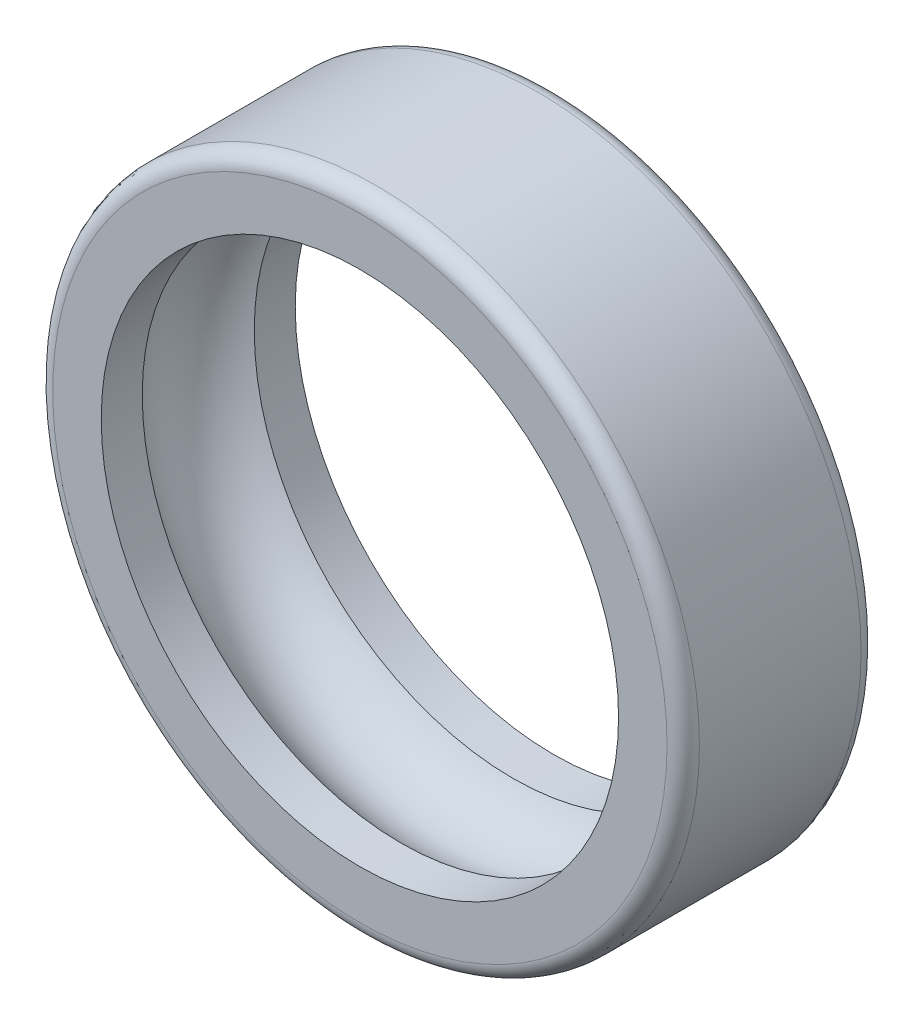
ISO-10303-21;
HEADER;
FILE_DESCRIPTION(('STEP AP214'),'2;1');
FILE_NAME('part.step','',(''),(''),'','','');
FILE_SCHEMA(('AUTOMOTIVE_DESIGN { 1 0 10303 214 1 1 1 1 }'));
ENDSEC;
DATA;
#1=APPLICATION_CONTEXT('core data for automotive mechanical design processes');
#2=APPLICATION_PROTOCOL_DEFINITION('international standard','automotive_design',2000,#1);
#3=PRODUCT_CONTEXT('',#1,'mechanical');
#4=PRODUCT('Part','Part','',(#3));
#5=PRODUCT_RELATED_PRODUCT_CATEGORY('part','',(#4));
#6=PRODUCT_DEFINITION_FORMATION('','',#4);
#7=PRODUCT_DEFINITION_CONTEXT('part definition',#1,'design');
#8=PRODUCT_DEFINITION('design','',#6,#7);
#9=PRODUCT_DEFINITION_SHAPE('','',#8);
#10=(LENGTH_UNIT() NAMED_UNIT(*) SI_UNIT(.MILLI.,.METRE.));
#11=(NAMED_UNIT(*) PLANE_ANGLE_UNIT() SI_UNIT($,.RADIAN.));
#12=(NAMED_UNIT(*) SI_UNIT($,.STERADIAN.) SOLID_ANGLE_UNIT());
#13=UNCERTAINTY_MEASURE_WITH_UNIT(LENGTH_MEASURE(1.E-05),#10,'distance_accuracy_value','');
#14=(GEOMETRIC_REPRESENTATION_CONTEXT(3) GLOBAL_UNCERTAINTY_ASSIGNED_CONTEXT((#13)) GLOBAL_UNIT_ASSIGNED_CONTEXT((#10,
#11,#12)) REPRESENTATION_CONTEXT('',''));
#15=CARTESIAN_POINT('',(0.,0.,0.));
#16=DIRECTION('',(0.,0.,1.));
#17=DIRECTION('',(1.,0.,0.));
#18=AXIS2_PLACEMENT_3D('',#15,#16,#17);
#19=CARTESIAN_POINT('',(0.,0.,3.));
#20=DIRECTION('',(0.,0.,-1.));
#21=DIRECTION('',(-1.,0.,0.));
#22=AXIS2_PLACEMENT_3D('',#19,#20,#21);
#23=CYLINDRICAL_SURFACE('',#22,8.);
#24=CARTESIAN_POINT('',(0.,0.,-1.73205080756888));
#25=DIRECTION('',(0.,0.,1.));
#26=DIRECTION('',(1.,0.,0.));
#27=AXIS2_PLACEMENT_3D('',#24,#25,#26);
#28=CIRCLE('',#27,8.);
#29=CARTESIAN_POINT('',(8.,0.,-1.73205080756888));
#30=VERTEX_POINT('',#29);
#31=EDGE_CURVE('E53',#30,#30,#28,.F.);
#32=ORIENTED_EDGE('',*,*,#31,.F.);
#33=EDGE_LOOP('',(#32));
#34=FACE_BOUND('',#33,.T.);
#35=CARTESIAN_POINT('',(0.,0.,-3.));
#36=DIRECTION('',(0.,0.,1.));
#37=DIRECTION('',(1.,0.,0.));
#38=AXIS2_PLACEMENT_3D('',#35,#36,#37);
#39=CIRCLE('',#38,8.);
#40=CARTESIAN_POINT('',(8.,0.,-3.));
#41=VERTEX_POINT('',#40);
#42=EDGE_CURVE('E56',#41,#41,#39,.T.);
#43=ORIENTED_EDGE('',*,*,#42,.F.);
#44=EDGE_LOOP('',(#43));
#45=FACE_BOUND('',#44,.T.);
#46=ADVANCED_FACE('F32',(#34,#45),#23,.F.);
#47=CARTESIAN_POINT('',(0.,0.,3.));
#48=DIRECTION('',(0.,0.,1.));
#49=DIRECTION('',(1.,0.,0.));
#50=AXIS2_PLACEMENT_3D('',#47,#48,#49);
#51=PLANE('',#50);
#52=CARTESIAN_POINT('',(0.,0.,3.));
#53=DIRECTION('',(0.,0.,1.));
#54=DIRECTION('',(1.,0.,0.));
#55=AXIS2_PLACEMENT_3D('',#52,#53,#54);
#56=CIRCLE('',#55,9.5);
#57=CARTESIAN_POINT('',(9.5,0.,3.));
#58=VERTEX_POINT('',#57);
#59=EDGE_CURVE('E10',#58,#58,#56,.T.);
#60=ORIENTED_EDGE('',*,*,#59,.T.);
#61=EDGE_LOOP('',(#60));
#62=FACE_BOUND('',#61,.T.);
#63=CARTESIAN_POINT('',(0.,0.,3.));
#64=DIRECTION('',(0.,0.,1.));
#65=DIRECTION('',(1.,0.,0.));
#66=AXIS2_PLACEMENT_3D('',#63,#64,#65);
#67=CIRCLE('',#66,8.);
#68=CARTESIAN_POINT('',(8.,0.,3.));
#69=VERTEX_POINT('',#68);
#70=EDGE_CURVE('E52',#69,#69,#67,.T.);
#71=ORIENTED_EDGE('',*,*,#70,.F.);
#72=EDGE_LOOP('',(#71));
#73=FACE_BOUND('',#72,.T.);
#74=ADVANCED_FACE('F67',(#62,#73),#51,.T.);
#75=CARTESIAN_POINT('',(0.,0.,-3.));
#76=DIRECTION('',(0.,0.,1.));
#77=DIRECTION('',(1.,0.,0.));
#78=AXIS2_PLACEMENT_3D('',#75,#76,#77);
#79=PLANE('',#78);
#80=CARTESIAN_POINT('',(0.,0.,-3.));
#81=DIRECTION('',(0.,0.,1.));
#82=DIRECTION('',(1.,0.,0.));
#83=AXIS2_PLACEMENT_3D('',#80,#81,#82);
#84=CIRCLE('',#83,9.5);
#85=CARTESIAN_POINT('',(9.5,0.,-3.));
#86=VERTEX_POINT('',#85);
#87=EDGE_CURVE('E39',#86,#86,#84,.F.);
#88=ORIENTED_EDGE('',*,*,#87,.T.);
#89=EDGE_LOOP('',(#88));
#90=FACE_BOUND('',#89,.T.);
#91=ORIENTED_EDGE('',*,*,#42,.T.);
#92=EDGE_LOOP('',(#91));
#93=FACE_BOUND('',#92,.T.);
#94=ADVANCED_FACE('F69',(#90,#93),#79,.F.);
#95=CARTESIAN_POINT('',(0.,0.,3.));
#96=DIRECTION('',(0.,0.,-1.));
#97=DIRECTION('',(-1.,0.,0.));
#98=AXIS2_PLACEMENT_3D('',#95,#96,#97);
#99=CYLINDRICAL_SURFACE('',#98,10.);
#100=CARTESIAN_POINT('',(0.,0.,-2.5));
#101=DIRECTION('',(0.,0.,1.));
#102=DIRECTION('',(1.,0.,0.));
#103=AXIS2_PLACEMENT_3D('',#100,#101,#102);
#104=CIRCLE('',#103,10.);
#105=CARTESIAN_POINT('',(10.,0.,-2.5));
#106=VERTEX_POINT('',#105);
#107=EDGE_CURVE('E43',#106,#106,#104,.T.);
#108=ORIENTED_EDGE('',*,*,#107,.T.);
#109=EDGE_LOOP('',(#108));
#110=FACE_BOUND('',#109,.T.);
#111=CARTESIAN_POINT('',(0.,0.,2.5));
#112=DIRECTION('',(0.,0.,1.));
#113=DIRECTION('',(1.,0.,0.));
#114=AXIS2_PLACEMENT_3D('',#111,#112,#113);
#115=CIRCLE('',#114,10.);
#116=CARTESIAN_POINT('',(10.,0.,2.5));
#117=VERTEX_POINT('',#116);
#118=EDGE_CURVE('E47',#117,#117,#115,.F.);
#119=ORIENTED_EDGE('',*,*,#118,.T.);
#120=EDGE_LOOP('',(#119));
#121=FACE_BOUND('',#120,.T.);
#122=ADVANCED_FACE('F75',(#110,#121),#99,.T.);
#123=CARTESIAN_POINT('',(0.,0.,1.73205080756888));
#124=DIRECTION('',(0.,0.,-1.));
#125=DIRECTION('',(-1.,0.,0.));
#126=AXIS2_PLACEMENT_3D('',#123,#124,#125);
#127=CIRCLE('',#126,8.);
#128=CARTESIAN_POINT('',(-8.,0.,1.73205080756888));
#129=VERTEX_POINT('',#128);
#130=EDGE_CURVE('E57',#129,#129,#127,.F.);
#131=ORIENTED_EDGE('',*,*,#130,.F.);
#132=EDGE_LOOP('',(#131));
#133=FACE_BOUND('',#132,.T.);
#134=ORIENTED_EDGE('',*,*,#70,.T.);
#135=EDGE_LOOP('',(#134));
#136=FACE_BOUND('',#135,.T.);
#137=ADVANCED_FACE('F65',(#133,#136),#23,.F.);
#138=CARTESIAN_POINT('',(0.,0.,0.));
#139=DIRECTION('',(0.,0.,-1.));
#140=DIRECTION('',(-1.,0.,0.));
#141=AXIS2_PLACEMENT_3D('',#138,#139,#140);
#142=TOROIDAL_SURFACE('',#141,7.,2.);
#143=ORIENTED_EDGE('',*,*,#31,.T.);
#144=EDGE_LOOP('',(#143));
#145=FACE_BOUND('',#144,.T.);
#146=ORIENTED_EDGE('',*,*,#130,.T.);
#147=EDGE_LOOP('',(#146));
#148=FACE_BOUND('',#147,.T.);
#149=ADVANCED_FACE('F85',(#145,#148),#142,.F.);
#150=CARTESIAN_POINT('',(0.,0.,-2.5));
#151=DIRECTION('',(0.,0.,1.));
#152=DIRECTION('',(1.,0.,0.));
#153=AXIS2_PLACEMENT_3D('',#150,#151,#152);
#154=TOROIDAL_SURFACE('',#153,9.5,0.5);
#155=ORIENTED_EDGE('',*,*,#87,.F.);
#156=EDGE_LOOP('',(#155));
#157=FACE_BOUND('',#156,.T.);
#158=ORIENTED_EDGE('',*,*,#107,.F.);
#159=EDGE_LOOP('',(#158));
#160=FACE_BOUND('',#159,.T.);
#161=ADVANCED_FACE('F83',(#157,#160),#154,.T.);
#162=CARTESIAN_POINT('',(0.,0.,2.5));
#163=DIRECTION('',(0.,0.,1.));
#164=DIRECTION('',(1.,0.,0.));
#165=AXIS2_PLACEMENT_3D('',#162,#163,#164);
#166=TOROIDAL_SURFACE('',#165,9.5,0.5);
#167=ORIENTED_EDGE('',*,*,#118,.F.);
#168=EDGE_LOOP('',(#167));
#169=FACE_BOUND('',#168,.T.);
#170=ORIENTED_EDGE('',*,*,#59,.F.);
#171=EDGE_LOOP('',(#170));
#172=FACE_BOUND('',#171,.T.);
#173=ADVANCED_FACE('F34',(#169,#172),#166,.T.);
#174=CLOSED_SHELL('',(#46,#74,#94,#122,#137,#149,#161,#173));
#175=MANIFOLD_SOLID_BREP('B2',#174);
#176=ADVANCED_BREP_SHAPE_REPRESENTATION('',(#18,#175),#14);
#177=SHAPE_DEFINITION_REPRESENTATION(#9,#176);
ENDSEC;
END-ISO-10303-21;
